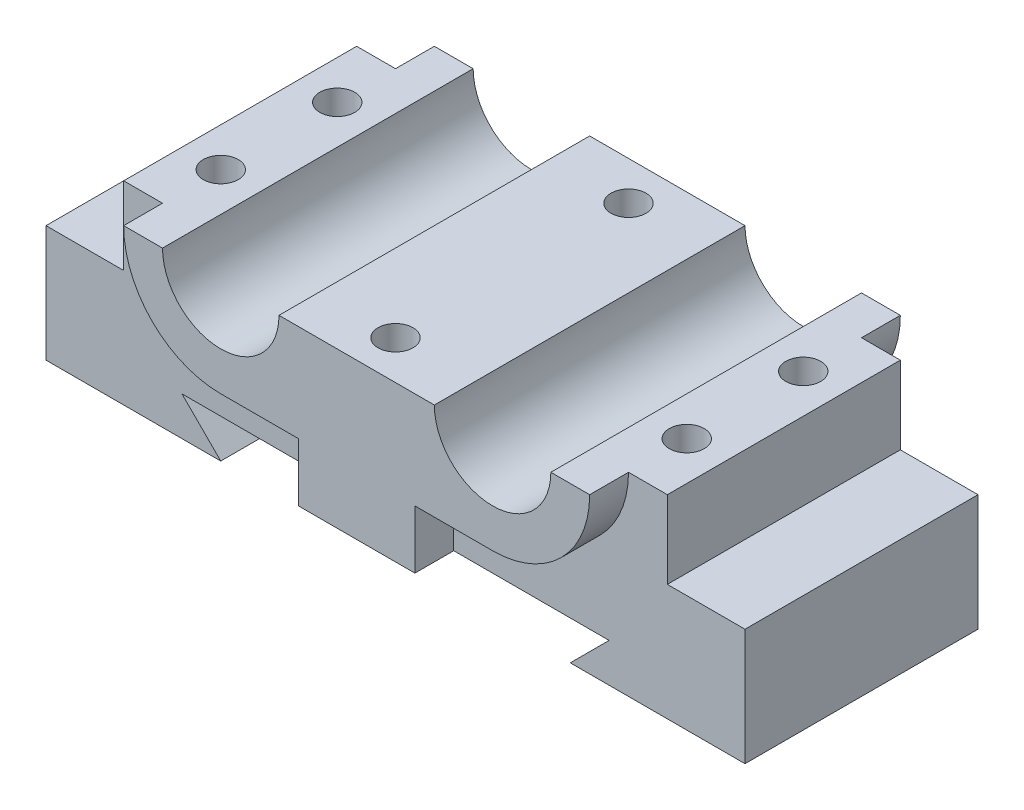
ISO-10303-21;
HEADER;
FILE_DESCRIPTION(('STEP AP214'),'2;1');
FILE_NAME('part.step','',(''),(''),'','','');
FILE_SCHEMA(('AUTOMOTIVE_DESIGN { 1 0 10303 214 1 1 1 1 }'));
ENDSEC;
DATA;
#1=APPLICATION_CONTEXT('core data for automotive mechanical design processes');
#2=APPLICATION_PROTOCOL_DEFINITION('international standard','automotive_design',2000,#1);
#3=PRODUCT_CONTEXT('',#1,'mechanical');
#4=PRODUCT('Part','Part','',(#3));
#5=PRODUCT_RELATED_PRODUCT_CATEGORY('part','',(#4));
#6=PRODUCT_DEFINITION_FORMATION('','',#4);
#7=PRODUCT_DEFINITION_CONTEXT('part definition',#1,'design');
#8=PRODUCT_DEFINITION('design','',#6,#7);
#9=PRODUCT_DEFINITION_SHAPE('','',#8);
#10=(LENGTH_UNIT() NAMED_UNIT(*) SI_UNIT(.MILLI.,.METRE.));
#11=(NAMED_UNIT(*) PLANE_ANGLE_UNIT() SI_UNIT($,.RADIAN.));
#12=(NAMED_UNIT(*) SI_UNIT($,.STERADIAN.) SOLID_ANGLE_UNIT());
#13=UNCERTAINTY_MEASURE_WITH_UNIT(LENGTH_MEASURE(1.E-05),#10,'distance_accuracy_value','');
#14=(GEOMETRIC_REPRESENTATION_CONTEXT(3) GLOBAL_UNCERTAINTY_ASSIGNED_CONTEXT((#13)) GLOBAL_UNIT_ASSIGNED_CONTEXT((#10,
#11,#12)) REPRESENTATION_CONTEXT('',''));
#15=CARTESIAN_POINT('',(0.,0.,0.));
#16=DIRECTION('',(0.,0.,1.));
#17=DIRECTION('',(1.,0.,0.));
#18=AXIS2_PLACEMENT_3D('',#15,#16,#17);
#19=CARTESIAN_POINT('',(9.99999999999999,25.,30.));
#20=DIRECTION('',(0.,-1.,0.));
#21=DIRECTION('',(0.,0.,-1.));
#22=AXIS2_PLACEMENT_3D('',#19,#20,#21);
#23=PLANE('',#22);
#24=CARTESIAN_POINT('',(15.,25.,22.5));
#25=DIRECTION('',(0.,1.,0.));
#26=DIRECTION('',(0.,0.,1.));
#27=AXIS2_PLACEMENT_3D('',#24,#25,#26);
#28=CIRCLE('',#27,2.25);
#29=CARTESIAN_POINT('',(15.,25.,24.75));
#30=VERTEX_POINT('',#29);
#31=EDGE_CURVE('E309',#30,#30,#28,.T.);
#32=ORIENTED_EDGE('',*,*,#31,.F.);
#33=EDGE_LOOP('',(#32));
#34=FACE_BOUND('',#33,.T.);
#35=CARTESIAN_POINT('',(15.,25.,7.5));
#36=DIRECTION('',(0.,1.,0.));
#37=DIRECTION('',(0.,0.,1.));
#38=AXIS2_PLACEMENT_3D('',#35,#36,#37);
#39=CIRCLE('',#38,2.25);
#40=CARTESIAN_POINT('',(15.,25.,9.75));
#41=VERTEX_POINT('',#40);
#42=EDGE_CURVE('E296',#41,#41,#39,.T.);
#43=ORIENTED_EDGE('',*,*,#42,.F.);
#44=EDGE_LOOP('',(#43));
#45=FACE_BOUND('',#44,.T.);
#46=DIRECTION('',(0.,0.,-1.));
#47=VECTOR('',#46,1.);
#48=CARTESIAN_POINT('',(20.,25.,35.));
#49=LINE('',#48,#47);
#50=CARTESIAN_POINT('',(20.,25.,-5.));
#51=VERTEX_POINT('',#50);
#52=CARTESIAN_POINT('',(20.,25.,35.));
#53=VERTEX_POINT('',#52);
#54=EDGE_CURVE('E55',#51,#53,#49,.F.);
#55=ORIENTED_EDGE('',*,*,#54,.F.);
#56=DIRECTION('',(-1.,0.,0.));
#57=VECTOR('',#56,1.);
#58=CARTESIAN_POINT('',(75.,25.,-5.));
#59=LINE('',#58,#57);
#60=CARTESIAN_POINT('',(15.,25.,-5.));
#61=VERTEX_POINT('',#60);
#62=EDGE_CURVE('E367',#51,#61,#59,.T.);
#63=ORIENTED_EDGE('',*,*,#62,.T.);
#64=DIRECTION('',(0.,0.,-1.));
#65=VECTOR('',#64,1.);
#66=CARTESIAN_POINT('',(15.,25.,35.));
#67=LINE('',#66,#65);
#68=CARTESIAN_POINT('',(15.,25.,0.));
#69=VERTEX_POINT('',#68);
#70=EDGE_CURVE('E404',#69,#61,#67,.T.);
#71=ORIENTED_EDGE('',*,*,#70,.F.);
#72=DIRECTION('',(-1.,0.,0.));
#73=VECTOR('',#72,1.);
#74=CARTESIAN_POINT('',(9.99999999999999,25.,0.));
#75=LINE('',#74,#73);
#76=CARTESIAN_POINT('',(9.99999999999999,25.,0.));
#77=VERTEX_POINT('',#76);
#78=EDGE_CURVE('E489',#69,#77,#75,.T.);
#79=ORIENTED_EDGE('',*,*,#78,.T.);
#80=DIRECTION('',(0.,0.,-1.));
#81=VECTOR('',#80,1.);
#82=CARTESIAN_POINT('',(9.99999999999999,25.,30.));
#83=LINE('',#82,#81);
#84=CARTESIAN_POINT('',(9.99999999999999,25.,30.));
#85=VERTEX_POINT('',#84);
#86=EDGE_CURVE('E506',#85,#77,#83,.T.);
#87=ORIENTED_EDGE('',*,*,#86,.F.);
#88=DIRECTION('',(-1.,0.,0.));
#89=VECTOR('',#88,1.);
#90=CARTESIAN_POINT('',(9.99999999999999,25.,30.));
#91=LINE('',#90,#89);
#92=CARTESIAN_POINT('',(15.,25.,30.));
#93=VERTEX_POINT('',#92);
#94=EDGE_CURVE('E461',#93,#85,#91,.T.);
#95=ORIENTED_EDGE('',*,*,#94,.F.);
#96=CARTESIAN_POINT('',(15.,25.,35.));
#97=VERTEX_POINT('',#96);
#98=EDGE_CURVE('E405',#97,#93,#67,.T.);
#99=ORIENTED_EDGE('',*,*,#98,.F.);
#100=DIRECTION('',(-1.,0.,0.));
#101=VECTOR('',#100,1.);
#102=CARTESIAN_POINT('',(75.,25.,35.));
#103=LINE('',#102,#101);
#104=EDGE_CURVE('E272',#53,#97,#103,.T.);
#105=ORIENTED_EDGE('',*,*,#104,.F.);
#106=EDGE_LOOP('',(#55,#63,#71,#79,#87,#95,#99,#105));
#107=FACE_BOUND('',#106,.T.);
#108=ADVANCED_FACE('F41',(#34,#45,#107),#23,.F.);
#109=CARTESIAN_POINT('',(45.,25.,30.));
#110=DIRECTION('',(0.,1.,0.));
#111=DIRECTION('',(0.,0.,1.));
#112=AXIS2_PLACEMENT_3D('',#109,#110,#111);
#113=CIRCLE('',#112,2.25);
#114=CARTESIAN_POINT('',(45.,25.,32.25));
#115=VERTEX_POINT('',#114);
#116=EDGE_CURVE('E321',#115,#115,#113,.T.);
#117=ORIENTED_EDGE('',*,*,#116,.F.);
#118=EDGE_LOOP('',(#117));
#119=FACE_BOUND('',#118,.T.);
#120=CARTESIAN_POINT('',(45.,25.,0.));
#121=DIRECTION('',(0.,1.,0.));
#122=DIRECTION('',(0.,0.,1.));
#123=AXIS2_PLACEMENT_3D('',#120,#121,#122);
#124=CIRCLE('',#123,2.25);
#125=CARTESIAN_POINT('',(45.,25.,2.25));
#126=VERTEX_POINT('',#125);
#127=EDGE_CURVE('E302',#126,#126,#124,.T.);
#128=ORIENTED_EDGE('',*,*,#127,.F.);
#129=EDGE_LOOP('',(#128));
#130=FACE_BOUND('',#129,.T.);
#131=DIRECTION('',(0.,0.,-1.));
#132=VECTOR('',#131,1.);
#133=CARTESIAN_POINT('',(35.,25.,35.));
#134=LINE('',#133,#132);
#135=CARTESIAN_POINT('',(35.,25.,35.));
#136=VERTEX_POINT('',#135);
#137=CARTESIAN_POINT('',(35.,25.,-5.));
#138=VERTEX_POINT('',#137);
#139=EDGE_CURVE('E288',#136,#138,#134,.T.);
#140=ORIENTED_EDGE('',*,*,#139,.F.);
#141=CARTESIAN_POINT('',(55.,25.,35.));
#142=VERTEX_POINT('',#141);
#143=EDGE_CURVE('E270',#142,#136,#103,.T.);
#144=ORIENTED_EDGE('',*,*,#143,.F.);
#145=DIRECTION('',(0.,0.,-1.));
#146=VECTOR('',#145,1.);
#147=CARTESIAN_POINT('',(55.,25.,35.));
#148=LINE('',#147,#146);
#149=CARTESIAN_POINT('',(55.,25.,-5.));
#150=VERTEX_POINT('',#149);
#151=EDGE_CURVE('E63',#150,#142,#148,.F.);
#152=ORIENTED_EDGE('',*,*,#151,.F.);
#153=EDGE_CURVE('E377',#150,#138,#59,.T.);
#154=ORIENTED_EDGE('',*,*,#153,.T.);
#155=EDGE_LOOP('',(#140,#144,#152,#154));
#156=FACE_BOUND('',#155,.T.);
#157=ADVANCED_FACE('F343',(#119,#130,#156),#23,.F.);
#158=CARTESIAN_POINT('',(75.,25.,7.5));
#159=DIRECTION('',(0.,1.,0.));
#160=DIRECTION('',(0.,0.,1.));
#161=AXIS2_PLACEMENT_3D('',#158,#159,#160);
#162=CIRCLE('',#161,2.25);
#163=CARTESIAN_POINT('',(75.,25.,9.74999999999999));
#164=VERTEX_POINT('',#163);
#165=EDGE_CURVE('E314',#164,#164,#162,.T.);
#166=ORIENTED_EDGE('',*,*,#165,.F.);
#167=EDGE_LOOP('',(#166));
#168=FACE_BOUND('',#167,.T.);
#169=CARTESIAN_POINT('',(75.,25.,22.5));
#170=DIRECTION('',(0.,1.,0.));
#171=DIRECTION('',(0.,0.,1.));
#172=AXIS2_PLACEMENT_3D('',#169,#170,#171);
#173=CIRCLE('',#172,2.25);
#174=CARTESIAN_POINT('',(75.,25.,24.75));
#175=VERTEX_POINT('',#174);
#176=EDGE_CURVE('E326',#175,#175,#173,.T.);
#177=ORIENTED_EDGE('',*,*,#176,.F.);
#178=EDGE_LOOP('',(#177));
#179=FACE_BOUND('',#178,.T.);
#180=DIRECTION('',(0.,0.,-1.));
#181=VECTOR('',#180,1.);
#182=CARTESIAN_POINT('',(70.,25.,35.));
#183=LINE('',#182,#181);
#184=CARTESIAN_POINT('',(70.,25.,35.));
#185=VERTEX_POINT('',#184);
#186=CARTESIAN_POINT('',(70.,25.,-5.));
#187=VERTEX_POINT('',#186);
#188=EDGE_CURVE('E248',#185,#187,#183,.T.);
#189=ORIENTED_EDGE('',*,*,#188,.F.);
#190=CARTESIAN_POINT('',(75.,25.,35.));
#191=VERTEX_POINT('',#190);
#192=EDGE_CURVE('E260',#191,#185,#103,.T.);
#193=ORIENTED_EDGE('',*,*,#192,.F.);
#194=DIRECTION('',(0.,0.,-1.));
#195=VECTOR('',#194,1.);
#196=CARTESIAN_POINT('',(75.,25.,35.));
#197=LINE('',#196,#195);
#198=CARTESIAN_POINT('',(75.,25.,30.));
#199=VERTEX_POINT('',#198);
#200=EDGE_CURVE('E409',#191,#199,#197,.T.);
#201=ORIENTED_EDGE('',*,*,#200,.T.);
#202=CARTESIAN_POINT('',(80.,25.,30.));
#203=VERTEX_POINT('',#202);
#204=EDGE_CURVE('E462',#203,#199,#91,.T.);
#205=ORIENTED_EDGE('',*,*,#204,.F.);
#206=DIRECTION('',(0.,0.,-1.));
#207=VECTOR('',#206,1.);
#208=CARTESIAN_POINT('',(80.,25.,30.));
#209=LINE('',#208,#207);
#210=CARTESIAN_POINT('',(80.,25.,0.));
#211=VERTEX_POINT('',#210);
#212=EDGE_CURVE('E509',#203,#211,#209,.T.);
#213=ORIENTED_EDGE('',*,*,#212,.T.);
#214=CARTESIAN_POINT('',(75.,25.,0.));
#215=VERTEX_POINT('',#214);
#216=EDGE_CURVE('E490',#211,#215,#75,.T.);
#217=ORIENTED_EDGE('',*,*,#216,.T.);
#218=CARTESIAN_POINT('',(75.,25.,-5.));
#219=VERTEX_POINT('',#218);
#220=EDGE_CURVE('E408',#215,#219,#197,.T.);
#221=ORIENTED_EDGE('',*,*,#220,.T.);
#222=EDGE_CURVE('E262',#219,#187,#59,.T.);
#223=ORIENTED_EDGE('',*,*,#222,.T.);
#224=EDGE_LOOP('',(#189,#193,#201,#205,#213,#217,#221,#223));
#225=FACE_BOUND('',#224,.T.);
#226=ADVANCED_FACE('F258',(#168,#179,#225),#23,.F.);
#227=CARTESIAN_POINT('',(0.,0.,30.));
#228=DIRECTION('',(0.,0.,-1.));
#229=DIRECTION('',(-1.,0.,0.));
#230=AXIS2_PLACEMENT_3D('',#227,#228,#229);
#231=PLANE('',#230);
#232=DIRECTION('',(0.,1.,0.));
#233=VECTOR('',#232,1.);
#234=CARTESIAN_POINT('',(52.5,0.,30.));
#235=LINE('',#234,#233);
#236=CARTESIAN_POINT('',(52.5,5.00000000000001,30.));
#237=VERTEX_POINT('',#236);
#238=CARTESIAN_POINT('',(52.5,12.5,30.));
#239=VERTEX_POINT('',#238);
#240=EDGE_CURVE('E438',#237,#239,#235,.T.);
#241=ORIENTED_EDGE('',*,*,#240,.F.);
#242=DIRECTION('',(1.,0.,0.));
#243=VECTOR('',#242,1.);
#244=CARTESIAN_POINT('',(72.5,5.00000000000001,30.));
#245=LINE('',#244,#243);
#246=CARTESIAN_POINT('',(72.5,5.00000000000001,30.));
#247=VERTEX_POINT('',#246);
#248=EDGE_CURVE('E448',#237,#247,#245,.T.);
#249=ORIENTED_EDGE('',*,*,#248,.T.);
#250=DIRECTION('',(-0.707106781186547,-0.707106781186548,0.));
#251=VECTOR('',#250,1.);
#252=CARTESIAN_POINT('',(67.5,0.,30.));
#253=LINE('',#252,#251);
#254=CARTESIAN_POINT('',(67.5,0.,30.));
#255=VERTEX_POINT('',#254);
#256=EDGE_CURVE('E451',#247,#255,#253,.T.);
#257=ORIENTED_EDGE('',*,*,#256,.T.);
#258=DIRECTION('',(1.,0.,0.));
#259=VECTOR('',#258,1.);
#260=CARTESIAN_POINT('',(90.,0.,30.));
#261=LINE('',#260,#259);
#262=CARTESIAN_POINT('',(90.,0.,30.));
#263=VERTEX_POINT('',#262);
#264=EDGE_CURVE('E453',#255,#263,#261,.T.);
#265=ORIENTED_EDGE('',*,*,#264,.T.);
#266=DIRECTION('',(0.,1.,0.));
#267=VECTOR('',#266,1.);
#268=CARTESIAN_POINT('',(90.,15.,30.));
#269=LINE('',#268,#267);
#270=CARTESIAN_POINT('',(90.,15.,30.));
#271=VERTEX_POINT('',#270);
#272=EDGE_CURVE('E455',#263,#271,#269,.T.);
#273=ORIENTED_EDGE('',*,*,#272,.T.);
#274=DIRECTION('',(-1.,0.,0.));
#275=VECTOR('',#274,1.);
#276=CARTESIAN_POINT('',(80.,15.,30.));
#277=LINE('',#276,#275);
#278=CARTESIAN_POINT('',(80.,15.,30.));
#279=VERTEX_POINT('',#278);
#280=EDGE_CURVE('E457',#271,#279,#277,.T.);
#281=ORIENTED_EDGE('',*,*,#280,.T.);
#282=DIRECTION('',(0.,1.,0.));
#283=VECTOR('',#282,1.);
#284=CARTESIAN_POINT('',(80.,25.,30.));
#285=LINE('',#284,#283);
#286=EDGE_CURVE('E459',#279,#203,#285,.T.);
#287=ORIENTED_EDGE('',*,*,#286,.T.);
#288=ORIENTED_EDGE('',*,*,#204,.T.);
#289=CARTESIAN_POINT('',(62.5,25.,30.));
#290=DIRECTION('',(0.,0.,-1.));
#291=DIRECTION('',(-1.,0.,0.));
#292=AXIS2_PLACEMENT_3D('',#289,#290,#291);
#293=CIRCLE('',#292,12.5);
#294=CARTESIAN_POINT('',(62.5,12.5,30.));
#295=VERTEX_POINT('',#294);
#296=EDGE_CURVE('E432',#295,#199,#293,.F.);
#297=ORIENTED_EDGE('',*,*,#296,.F.);
#298=DIRECTION('',(1.,0.,0.));
#299=VECTOR('',#298,1.);
#300=CARTESIAN_POINT('',(0.,12.5,30.));
#301=LINE('',#300,#299);
#302=EDGE_CURVE('E435',#239,#295,#301,.T.);
#303=ORIENTED_EDGE('',*,*,#302,.F.);
#304=EDGE_LOOP('',(#241,#249,#257,#265,#273,#281,#287,#288,#297,#303));
#305=FACE_BOUND('',#304,.T.);
#306=ADVANCED_FACE('F342',(#305),#231,.F.);
#307=CARTESIAN_POINT('',(27.5,25.,30.));
#308=DIRECTION('',(0.,0.,-1.));
#309=DIRECTION('',(-1.,0.,0.));
#310=AXIS2_PLACEMENT_3D('',#307,#308,#309);
#311=CIRCLE('',#310,12.5);
#312=CARTESIAN_POINT('',(27.5,12.5,30.));
#313=VERTEX_POINT('',#312);
#314=EDGE_CURVE('E429',#93,#313,#311,.F.);
#315=ORIENTED_EDGE('',*,*,#314,.F.);
#316=ORIENTED_EDGE('',*,*,#94,.T.);
#317=DIRECTION('',(0.,-1.,0.));
#318=VECTOR('',#317,1.);
#319=CARTESIAN_POINT('',(9.99999999999999,15.,30.));
#320=LINE('',#319,#318);
#321=CARTESIAN_POINT('',(9.99999999999999,15.,30.));
#322=VERTEX_POINT('',#321);
#323=EDGE_CURVE('E464',#85,#322,#320,.T.);
#324=ORIENTED_EDGE('',*,*,#323,.T.);
#325=DIRECTION('',(-1.,0.,0.));
#326=VECTOR('',#325,1.);
#327=CARTESIAN_POINT('',(0.,15.,30.));
#328=LINE('',#327,#326);
#329=CARTESIAN_POINT('',(0.,15.,30.));
#330=VERTEX_POINT('',#329);
#331=EDGE_CURVE('E466',#322,#330,#328,.T.);
#332=ORIENTED_EDGE('',*,*,#331,.T.);
#333=DIRECTION('',(0.,-1.,0.));
#334=VECTOR('',#333,1.);
#335=CARTESIAN_POINT('',(0.,0.,30.));
#336=LINE('',#335,#334);
#337=CARTESIAN_POINT('',(0.,0.,30.));
#338=VERTEX_POINT('',#337);
#339=EDGE_CURVE('E468',#330,#338,#336,.T.);
#340=ORIENTED_EDGE('',*,*,#339,.T.);
#341=DIRECTION('',(1.,0.,0.));
#342=VECTOR('',#341,1.);
#343=CARTESIAN_POINT('',(22.5,0.,30.));
#344=LINE('',#343,#342);
#345=CARTESIAN_POINT('',(22.5,0.,30.));
#346=VERTEX_POINT('',#345);
#347=EDGE_CURVE('E442',#338,#346,#344,.T.);
#348=ORIENTED_EDGE('',*,*,#347,.T.);
#349=DIRECTION('',(-0.707106781186548,0.707106781186547,0.));
#350=VECTOR('',#349,1.);
#351=CARTESIAN_POINT('',(17.5,5.,30.));
#352=LINE('',#351,#350);
#353=CARTESIAN_POINT('',(17.5,5.,30.));
#354=VERTEX_POINT('',#353);
#355=EDGE_CURVE('E445',#346,#354,#352,.T.);
#356=ORIENTED_EDGE('',*,*,#355,.T.);
#357=CARTESIAN_POINT('',(37.5,5.,30.));
#358=VERTEX_POINT('',#357);
#359=EDGE_CURVE('E449',#354,#358,#245,.T.);
#360=ORIENTED_EDGE('',*,*,#359,.T.);
#361=DIRECTION('',(0.,-1.,0.));
#362=VECTOR('',#361,1.);
#363=CARTESIAN_POINT('',(37.5,0.,30.));
#364=LINE('',#363,#362);
#365=CARTESIAN_POINT('',(37.5,12.5,30.));
#366=VERTEX_POINT('',#365);
#367=EDGE_CURVE('E423',#366,#358,#364,.T.);
#368=ORIENTED_EDGE('',*,*,#367,.F.);
#369=DIRECTION('',(1.,0.,0.));
#370=VECTOR('',#369,1.);
#371=CARTESIAN_POINT('',(0.,12.5,30.));
#372=LINE('',#371,#370);
#373=EDGE_CURVE('E426',#313,#366,#372,.T.);
#374=ORIENTED_EDGE('',*,*,#373,.F.);
#375=EDGE_LOOP('',(#315,#316,#324,#332,#340,#348,#356,#360,#368,#374));
#376=FACE_BOUND('',#375,.T.);
#377=ADVANCED_FACE('F350',(#376),#231,.F.);
#378=CARTESIAN_POINT('',(0.,0.,0.));
#379=DIRECTION('',(0.,0.,-1.));
#380=DIRECTION('',(-1.,0.,0.));
#381=AXIS2_PLACEMENT_3D('',#378,#379,#380);
#382=PLANE('',#381);
#383=DIRECTION('',(1.,0.,0.));
#384=VECTOR('',#383,1.);
#385=CARTESIAN_POINT('',(72.5,5.00000000000001,0.));
#386=LINE('',#385,#384);
#387=CARTESIAN_POINT('',(52.5,5.,0.));
#388=VERTEX_POINT('',#387);
#389=CARTESIAN_POINT('',(72.5,5.00000000000001,0.));
#390=VERTEX_POINT('',#389);
#391=EDGE_CURVE('E475',#388,#390,#386,.T.);
#392=ORIENTED_EDGE('',*,*,#391,.F.);
#393=DIRECTION('',(0.,1.,0.));
#394=VECTOR('',#393,1.);
#395=CARTESIAN_POINT('',(52.5,0.,0.));
#396=LINE('',#395,#394);
#397=CARTESIAN_POINT('',(52.5,12.5,0.));
#398=VERTEX_POINT('',#397);
#399=EDGE_CURVE('E254',#388,#398,#396,.T.);
#400=ORIENTED_EDGE('',*,*,#399,.T.);
#401=DIRECTION('',(1.,0.,0.));
#402=VECTOR('',#401,1.);
#403=CARTESIAN_POINT('',(0.,12.5,0.));
#404=LINE('',#403,#402);
#405=CARTESIAN_POINT('',(62.5,12.5,0.));
#406=VERTEX_POINT('',#405);
#407=EDGE_CURVE('E545',#398,#406,#404,.T.);
#408=ORIENTED_EDGE('',*,*,#407,.T.);
#409=CARTESIAN_POINT('',(62.5,25.,0.));
#410=DIRECTION('',(0.,0.,-1.));
#411=DIRECTION('',(-1.,0.,0.));
#412=AXIS2_PLACEMENT_3D('',#409,#410,#411);
#413=CIRCLE('',#412,12.5);
#414=EDGE_CURVE('E542',#406,#215,#413,.F.);
#415=ORIENTED_EDGE('',*,*,#414,.T.);
#416=ORIENTED_EDGE('',*,*,#216,.F.);
#417=DIRECTION('',(0.,1.,0.));
#418=VECTOR('',#417,1.);
#419=CARTESIAN_POINT('',(80.,25.,0.));
#420=LINE('',#419,#418);
#421=CARTESIAN_POINT('',(80.,15.,0.));
#422=VERTEX_POINT('',#421);
#423=EDGE_CURVE('E487',#422,#211,#420,.T.);
#424=ORIENTED_EDGE('',*,*,#423,.F.);
#425=DIRECTION('',(-1.,0.,0.));
#426=VECTOR('',#425,1.);
#427=CARTESIAN_POINT('',(80.,15.,0.));
#428=LINE('',#427,#426);
#429=CARTESIAN_POINT('',(90.,15.,0.));
#430=VERTEX_POINT('',#429);
#431=EDGE_CURVE('E485',#430,#422,#428,.T.);
#432=ORIENTED_EDGE('',*,*,#431,.F.);
#433=DIRECTION('',(0.,1.,0.));
#434=VECTOR('',#433,1.);
#435=CARTESIAN_POINT('',(90.,15.,0.));
#436=LINE('',#435,#434);
#437=CARTESIAN_POINT('',(90.,0.,0.));
#438=VERTEX_POINT('',#437);
#439=EDGE_CURVE('E483',#438,#430,#436,.T.);
#440=ORIENTED_EDGE('',*,*,#439,.F.);
#441=DIRECTION('',(1.,0.,0.));
#442=VECTOR('',#441,1.);
#443=CARTESIAN_POINT('',(90.,0.,0.));
#444=LINE('',#443,#442);
#445=CARTESIAN_POINT('',(67.5,0.,0.));
#446=VERTEX_POINT('',#445);
#447=EDGE_CURVE('E481',#446,#438,#444,.T.);
#448=ORIENTED_EDGE('',*,*,#447,.F.);
#449=DIRECTION('',(-0.707106781186547,-0.707106781186548,0.));
#450=VECTOR('',#449,1.);
#451=CARTESIAN_POINT('',(67.5,0.,0.));
#452=LINE('',#451,#450);
#453=EDGE_CURVE('E479',#390,#446,#452,.T.);
#454=ORIENTED_EDGE('',*,*,#453,.F.);
#455=EDGE_LOOP('',(#392,#400,#408,#415,#416,#424,#432,#440,#448,#454));
#456=FACE_BOUND('',#455,.T.);
#457=ADVANCED_FACE('F551',(#456),#382,.T.);
#458=ORIENTED_EDGE('',*,*,#78,.F.);
#459=CARTESIAN_POINT('',(27.5,25.,0.));
#460=DIRECTION('',(0.,0.,-1.));
#461=DIRECTION('',(-1.,0.,0.));
#462=AXIS2_PLACEMENT_3D('',#459,#460,#461);
#463=CIRCLE('',#462,12.5);
#464=CARTESIAN_POINT('',(27.5,12.5,0.));
#465=VERTEX_POINT('',#464);
#466=EDGE_CURVE('E539',#69,#465,#463,.F.);
#467=ORIENTED_EDGE('',*,*,#466,.T.);
#468=DIRECTION('',(1.,0.,0.));
#469=VECTOR('',#468,1.);
#470=CARTESIAN_POINT('',(0.,12.5,0.));
#471=LINE('',#470,#469);
#472=CARTESIAN_POINT('',(37.5,12.5,0.));
#473=VERTEX_POINT('',#472);
#474=EDGE_CURVE('E536',#465,#473,#471,.T.);
#475=ORIENTED_EDGE('',*,*,#474,.T.);
#476=DIRECTION('',(0.,-1.,0.));
#477=VECTOR('',#476,1.);
#478=CARTESIAN_POINT('',(37.5,0.,0.));
#479=LINE('',#478,#477);
#480=CARTESIAN_POINT('',(37.5,5.,0.));
#481=VERTEX_POINT('',#480);
#482=EDGE_CURVE('E533',#473,#481,#479,.T.);
#483=ORIENTED_EDGE('',*,*,#482,.T.);
#484=CARTESIAN_POINT('',(17.5,5.,0.));
#485=VERTEX_POINT('',#484);
#486=EDGE_CURVE('E476',#485,#481,#386,.T.);
#487=ORIENTED_EDGE('',*,*,#486,.F.);
#488=DIRECTION('',(-0.707106781186548,0.707106781186547,0.));
#489=VECTOR('',#488,1.);
#490=CARTESIAN_POINT('',(17.5,5.,0.));
#491=LINE('',#490,#489);
#492=CARTESIAN_POINT('',(22.5,0.,0.));
#493=VERTEX_POINT('',#492);
#494=EDGE_CURVE('E473',#493,#485,#491,.T.);
#495=ORIENTED_EDGE('',*,*,#494,.F.);
#496=DIRECTION('',(1.,0.,0.));
#497=VECTOR('',#496,1.);
#498=CARTESIAN_POINT('',(22.5,0.,0.));
#499=LINE('',#498,#497);
#500=CARTESIAN_POINT('',(0.,0.,0.));
#501=VERTEX_POINT('',#500);
#502=EDGE_CURVE('E441',#501,#493,#499,.T.);
#503=ORIENTED_EDGE('',*,*,#502,.F.);
#504=DIRECTION('',(0.,-1.,0.));
#505=VECTOR('',#504,1.);
#506=CARTESIAN_POINT('',(0.,0.,0.));
#507=LINE('',#506,#505);
#508=CARTESIAN_POINT('',(0.,15.,0.));
#509=VERTEX_POINT('',#508);
#510=EDGE_CURVE('E446',#509,#501,#507,.T.);
#511=ORIENTED_EDGE('',*,*,#510,.F.);
#512=DIRECTION('',(-1.,0.,0.));
#513=VECTOR('',#512,1.);
#514=CARTESIAN_POINT('',(0.,15.,0.));
#515=LINE('',#514,#513);
#516=CARTESIAN_POINT('',(9.99999999999999,15.,0.));
#517=VERTEX_POINT('',#516);
#518=EDGE_CURVE('E495',#517,#509,#515,.T.);
#519=ORIENTED_EDGE('',*,*,#518,.F.);
#520=DIRECTION('',(0.,-1.,0.));
#521=VECTOR('',#520,1.);
#522=CARTESIAN_POINT('',(9.99999999999999,15.,0.));
#523=LINE('',#522,#521);
#524=EDGE_CURVE('E493',#77,#517,#523,.T.);
#525=ORIENTED_EDGE('',*,*,#524,.F.);
#526=EDGE_LOOP('',(#458,#467,#475,#483,#487,#495,#503,#511,#519,#525));
#527=FACE_BOUND('',#526,.T.);
#528=ADVANCED_FACE('F652',(#527),#382,.T.);
#529=CARTESIAN_POINT('',(22.5,0.,30.));
#530=DIRECTION('',(0.,1.,0.));
#531=DIRECTION('',(-1.,0.,0.));
#532=AXIS2_PLACEMENT_3D('',#529,#530,#531);
#533=PLANE('',#532);
#534=ORIENTED_EDGE('',*,*,#502,.T.);
#535=DIRECTION('',(0.,0.,-1.));
#536=VECTOR('',#535,1.);
#537=CARTESIAN_POINT('',(22.5,0.,30.));
#538=LINE('',#537,#536);
#539=EDGE_CURVE('E530',#346,#493,#538,.T.);
#540=ORIENTED_EDGE('',*,*,#539,.F.);
#541=ORIENTED_EDGE('',*,*,#347,.F.);
#542=DIRECTION('',(0.,0.,-1.));
#543=VECTOR('',#542,1.);
#544=CARTESIAN_POINT('',(0.,0.,30.));
#545=LINE('',#544,#543);
#546=EDGE_CURVE('E470',#338,#501,#545,.T.);
#547=ORIENTED_EDGE('',*,*,#546,.T.);
#548=EDGE_LOOP('',(#534,#540,#541,#547));
#549=FACE_BOUND('',#548,.T.);
#550=ADVANCED_FACE('F43',(#549),#533,.F.);
#551=CARTESIAN_POINT('',(17.5,5.,30.));
#552=DIRECTION('',(-0.707106781186547,-0.707106781186548,0.));
#553=DIRECTION('',(0.707106781186548,-0.707106781186547,0.));
#554=AXIS2_PLACEMENT_3D('',#551,#552,#553);
#555=PLANE('',#554);
#556=ORIENTED_EDGE('',*,*,#494,.T.);
#557=DIRECTION('',(0.,0.,-1.));
#558=VECTOR('',#557,1.);
#559=CARTESIAN_POINT('',(17.5,5.,30.));
#560=LINE('',#559,#558);
#561=EDGE_CURVE('E527',#354,#485,#560,.T.);
#562=ORIENTED_EDGE('',*,*,#561,.F.);
#563=ORIENTED_EDGE('',*,*,#355,.F.);
#564=ORIENTED_EDGE('',*,*,#539,.T.);
#565=EDGE_LOOP('',(#556,#562,#563,#564));
#566=FACE_BOUND('',#565,.T.);
#567=ADVANCED_FACE('F688',(#566),#555,.F.);
#568=CARTESIAN_POINT('',(72.5,5.00000000000001,30.));
#569=DIRECTION('',(0.,1.,0.));
#570=DIRECTION('',(-1.,0.,0.));
#571=AXIS2_PLACEMENT_3D('',#568,#569,#570);
#572=PLANE('',#571);
#573=DIRECTION('',(0.,0.,-1.));
#574=VECTOR('',#573,1.);
#575=CARTESIAN_POINT('',(37.5,5.,35.));
#576=LINE('',#575,#574);
#577=CARTESIAN_POINT('',(37.5,5.,35.));
#578=VERTEX_POINT('',#577);
#579=EDGE_CURVE('E392',#578,#358,#576,.T.);
#580=ORIENTED_EDGE('',*,*,#579,.T.);
#581=ORIENTED_EDGE('',*,*,#359,.F.);
#582=ORIENTED_EDGE('',*,*,#561,.T.);
#583=ORIENTED_EDGE('',*,*,#486,.T.);
#584=CARTESIAN_POINT('',(37.5,5.,-5.));
#585=VERTEX_POINT('',#584);
#586=EDGE_CURVE('E396',#481,#585,#576,.T.);
#587=ORIENTED_EDGE('',*,*,#586,.T.);
#588=DIRECTION('',(1.,0.,0.));
#589=VECTOR('',#588,1.);
#590=CARTESIAN_POINT('',(45.,5.,-5.));
#591=LINE('',#590,#589);
#592=CARTESIAN_POINT('',(52.5,5.,-5.));
#593=VERTEX_POINT('',#592);
#594=EDGE_CURVE('E287',#585,#593,#591,.T.);
#595=ORIENTED_EDGE('',*,*,#594,.T.);
#596=DIRECTION('',(0.,0.,-1.));
#597=VECTOR('',#596,1.);
#598=CARTESIAN_POINT('',(52.5,5.,35.));
#599=LINE('',#598,#597);
#600=EDGE_CURVE('E419',#388,#593,#599,.T.);
#601=ORIENTED_EDGE('',*,*,#600,.F.);
#602=ORIENTED_EDGE('',*,*,#391,.T.);
#603=DIRECTION('',(0.,0.,-1.));
#604=VECTOR('',#603,1.);
#605=CARTESIAN_POINT('',(72.5,5.00000000000001,30.));
#606=LINE('',#605,#604);
#607=EDGE_CURVE('E524',#247,#390,#606,.T.);
#608=ORIENTED_EDGE('',*,*,#607,.F.);
#609=ORIENTED_EDGE('',*,*,#248,.F.);
#610=CARTESIAN_POINT('',(52.5,5.,35.));
#611=VERTEX_POINT('',#610);
#612=EDGE_CURVE('E420',#611,#237,#599,.T.);
#613=ORIENTED_EDGE('',*,*,#612,.F.);
#614=DIRECTION('',(1.,0.,0.));
#615=VECTOR('',#614,1.);
#616=CARTESIAN_POINT('',(45.,5.,35.));
#617=LINE('',#616,#615);
#618=EDGE_CURVE('E283',#578,#611,#617,.T.);
#619=ORIENTED_EDGE('',*,*,#618,.F.);
#620=EDGE_LOOP('',(#580,#581,#582,#583,#587,#595,#601,#602,#608,#609,#613,#619));
#621=FACE_BOUND('',#620,.T.);
#622=ADVANCED_FACE('F560',(#621),#572,.F.);
#623=CARTESIAN_POINT('',(67.5,0.,30.));
#624=DIRECTION('',(0.707106781186548,-0.707106781186547,0.));
#625=DIRECTION('',(0.707106781186547,0.707106781186548,0.));
#626=AXIS2_PLACEMENT_3D('',#623,#624,#625);
#627=PLANE('',#626);
#628=ORIENTED_EDGE('',*,*,#453,.T.);
#629=DIRECTION('',(0.,0.,-1.));
#630=VECTOR('',#629,1.);
#631=CARTESIAN_POINT('',(67.5,0.,30.));
#632=LINE('',#631,#630);
#633=EDGE_CURVE('E521',#255,#446,#632,.T.);
#634=ORIENTED_EDGE('',*,*,#633,.F.);
#635=ORIENTED_EDGE('',*,*,#256,.F.);
#636=ORIENTED_EDGE('',*,*,#607,.T.);
#637=EDGE_LOOP('',(#628,#634,#635,#636));
#638=FACE_BOUND('',#637,.T.);
#639=ADVANCED_FACE('F694',(#638),#627,.F.);
#640=CARTESIAN_POINT('',(90.,0.,30.));
#641=DIRECTION('',(0.,1.,0.));
#642=DIRECTION('',(-1.,0.,0.));
#643=AXIS2_PLACEMENT_3D('',#640,#641,#642);
#644=PLANE('',#643);
#645=ORIENTED_EDGE('',*,*,#447,.T.);
#646=DIRECTION('',(0.,0.,-1.));
#647=VECTOR('',#646,1.);
#648=CARTESIAN_POINT('',(90.,0.,30.));
#649=LINE('',#648,#647);
#650=EDGE_CURVE('E518',#263,#438,#649,.T.);
#651=ORIENTED_EDGE('',*,*,#650,.F.);
#652=ORIENTED_EDGE('',*,*,#264,.F.);
#653=ORIENTED_EDGE('',*,*,#633,.T.);
#654=EDGE_LOOP('',(#645,#651,#652,#653));
#655=FACE_BOUND('',#654,.T.);
#656=ADVANCED_FACE('F699',(#655),#644,.F.);
#657=CARTESIAN_POINT('',(90.,15.,30.));
#658=DIRECTION('',(-1.,0.,0.));
#659=DIRECTION('',(0.,0.,1.));
#660=AXIS2_PLACEMENT_3D('',#657,#658,#659);
#661=PLANE('',#660);
#662=ORIENTED_EDGE('',*,*,#439,.T.);
#663=DIRECTION('',(0.,0.,-1.));
#664=VECTOR('',#663,1.);
#665=CARTESIAN_POINT('',(90.,15.,30.));
#666=LINE('',#665,#664);
#667=EDGE_CURVE('E515',#271,#430,#666,.T.);
#668=ORIENTED_EDGE('',*,*,#667,.F.);
#669=ORIENTED_EDGE('',*,*,#272,.F.);
#670=ORIENTED_EDGE('',*,*,#650,.T.);
#671=EDGE_LOOP('',(#662,#668,#669,#670));
#672=FACE_BOUND('',#671,.T.);
#673=ADVANCED_FACE('F703',(#672),#661,.F.);
#674=CARTESIAN_POINT('',(80.,15.,30.));
#675=DIRECTION('',(0.,-1.,0.));
#676=DIRECTION('',(0.,0.,-1.));
#677=AXIS2_PLACEMENT_3D('',#674,#675,#676);
#678=PLANE('',#677);
#679=ORIENTED_EDGE('',*,*,#431,.T.);
#680=DIRECTION('',(0.,0.,-1.));
#681=VECTOR('',#680,1.);
#682=CARTESIAN_POINT('',(80.,15.,30.));
#683=LINE('',#682,#681);
#684=EDGE_CURVE('E512',#279,#422,#683,.T.);
#685=ORIENTED_EDGE('',*,*,#684,.F.);
#686=ORIENTED_EDGE('',*,*,#280,.F.);
#687=ORIENTED_EDGE('',*,*,#667,.T.);
#688=EDGE_LOOP('',(#679,#685,#686,#687));
#689=FACE_BOUND('',#688,.T.);
#690=ADVANCED_FACE('F665',(#689),#678,.F.);
#691=CARTESIAN_POINT('',(80.,25.,30.));
#692=DIRECTION('',(-1.,0.,0.));
#693=DIRECTION('',(0.,0.,1.));
#694=AXIS2_PLACEMENT_3D('',#691,#692,#693);
#695=PLANE('',#694);
#696=ORIENTED_EDGE('',*,*,#423,.T.);
#697=ORIENTED_EDGE('',*,*,#212,.F.);
#698=ORIENTED_EDGE('',*,*,#286,.F.);
#699=ORIENTED_EDGE('',*,*,#684,.T.);
#700=EDGE_LOOP('',(#696,#697,#698,#699));
#701=FACE_BOUND('',#700,.T.);
#702=ADVANCED_FACE('F606',(#701),#695,.F.);
#703=CARTESIAN_POINT('',(9.99999999999999,15.,30.));
#704=DIRECTION('',(1.,0.,0.));
#705=DIRECTION('',(0.,0.,-1.));
#706=AXIS2_PLACEMENT_3D('',#703,#704,#705);
#707=PLANE('',#706);
#708=ORIENTED_EDGE('',*,*,#524,.T.);
#709=DIRECTION('',(0.,0.,-1.));
#710=VECTOR('',#709,1.);
#711=CARTESIAN_POINT('',(9.99999999999999,15.,30.));
#712=LINE('',#711,#710);
#713=EDGE_CURVE('E503',#322,#517,#712,.T.);
#714=ORIENTED_EDGE('',*,*,#713,.F.);
#715=ORIENTED_EDGE('',*,*,#323,.F.);
#716=ORIENTED_EDGE('',*,*,#86,.T.);
#717=EDGE_LOOP('',(#708,#714,#715,#716));
#718=FACE_BOUND('',#717,.T.);
#719=ADVANCED_FACE('F658',(#718),#707,.F.);
#720=CARTESIAN_POINT('',(0.,15.,30.));
#721=DIRECTION('',(0.,-1.,0.));
#722=DIRECTION('',(0.,0.,-1.));
#723=AXIS2_PLACEMENT_3D('',#720,#721,#722);
#724=PLANE('',#723);
#725=ORIENTED_EDGE('',*,*,#518,.T.);
#726=DIRECTION('',(0.,0.,-1.));
#727=VECTOR('',#726,1.);
#728=CARTESIAN_POINT('',(0.,15.,30.));
#729=LINE('',#728,#727);
#730=EDGE_CURVE('E500',#330,#509,#729,.T.);
#731=ORIENTED_EDGE('',*,*,#730,.F.);
#732=ORIENTED_EDGE('',*,*,#331,.F.);
#733=ORIENTED_EDGE('',*,*,#713,.T.);
#734=EDGE_LOOP('',(#725,#731,#732,#733));
#735=FACE_BOUND('',#734,.T.);
#736=ADVANCED_FACE('F655',(#735),#724,.F.);
#737=CARTESIAN_POINT('',(0.,0.,30.));
#738=DIRECTION('',(1.,0.,0.));
#739=DIRECTION('',(0.,0.,-1.));
#740=AXIS2_PLACEMENT_3D('',#737,#738,#739);
#741=PLANE('',#740);
#742=ORIENTED_EDGE('',*,*,#510,.T.);
#743=ORIENTED_EDGE('',*,*,#546,.F.);
#744=ORIENTED_EDGE('',*,*,#339,.F.);
#745=ORIENTED_EDGE('',*,*,#730,.T.);
#746=EDGE_LOOP('',(#742,#743,#744,#745));
#747=FACE_BOUND('',#746,.T.);
#748=ADVANCED_FACE('F630',(#747),#741,.F.);
#749=CARTESIAN_POINT('',(27.5,25.,-5.));
#750=DIRECTION('',(0.,0.,-1.));
#751=DIRECTION('',(-1.,0.,0.));
#752=AXIS2_PLACEMENT_3D('',#749,#750,#751);
#753=PLANE('',#752);
#754=ORIENTED_EDGE('',*,*,#62,.F.);
#755=CARTESIAN_POINT('',(27.5,25.,-5.));
#756=DIRECTION('',(0.,0.,1.));
#757=DIRECTION('',(1.,0.,0.));
#758=AXIS2_PLACEMENT_3D('',#755,#756,#757);
#759=CIRCLE('',#758,7.5);
#760=EDGE_CURVE('E263',#51,#138,#759,.T.);
#761=ORIENTED_EDGE('',*,*,#760,.T.);
#762=ORIENTED_EDGE('',*,*,#153,.F.);
#763=CARTESIAN_POINT('',(62.5,25.,-5.));
#764=DIRECTION('',(0.,0.,1.));
#765=DIRECTION('',(1.,0.,0.));
#766=AXIS2_PLACEMENT_3D('',#763,#764,#765);
#767=CIRCLE('',#766,7.50000000000001);
#768=EDGE_CURVE('E291',#150,#187,#767,.T.);
#769=ORIENTED_EDGE('',*,*,#768,.T.);
#770=ORIENTED_EDGE('',*,*,#222,.F.);
#771=CARTESIAN_POINT('',(62.5,25.,-5.));
#772=DIRECTION('',(0.,0.,1.));
#773=DIRECTION('',(1.,0.,0.));
#774=AXIS2_PLACEMENT_3D('',#771,#772,#773);
#775=CIRCLE('',#774,12.5);
#776=CARTESIAN_POINT('',(62.5,12.5,-5.));
#777=VERTEX_POINT('',#776);
#778=EDGE_CURVE('E378',#777,#219,#775,.T.);
#779=ORIENTED_EDGE('',*,*,#778,.F.);
#780=DIRECTION('',(1.,0.,0.));
#781=VECTOR('',#780,1.);
#782=CARTESIAN_POINT('',(52.5,12.5,-5.));
#783=LINE('',#782,#781);
#784=CARTESIAN_POINT('',(52.5,12.5,-5.));
#785=VERTEX_POINT('',#784);
#786=EDGE_CURVE('E381',#785,#777,#783,.T.);
#787=ORIENTED_EDGE('',*,*,#786,.F.);
#788=DIRECTION('',(0.,1.,0.));
#789=VECTOR('',#788,1.);
#790=CARTESIAN_POINT('',(52.5,5.,-5.));
#791=LINE('',#790,#789);
#792=EDGE_CURVE('E565',#593,#785,#791,.T.);
#793=ORIENTED_EDGE('',*,*,#792,.F.);
#794=ORIENTED_EDGE('',*,*,#594,.F.);
#795=DIRECTION('',(0.,-1.,0.));
#796=VECTOR('',#795,1.);
#797=CARTESIAN_POINT('',(37.5,5.,-5.));
#798=LINE('',#797,#796);
#799=CARTESIAN_POINT('',(37.5,12.5,-5.));
#800=VERTEX_POINT('',#799);
#801=EDGE_CURVE('E285',#800,#585,#798,.T.);
#802=ORIENTED_EDGE('',*,*,#801,.F.);
#803=DIRECTION('',(1.,0.,0.));
#804=VECTOR('',#803,1.);
#805=CARTESIAN_POINT('',(37.5,12.5,-5.));
#806=LINE('',#805,#804);
#807=CARTESIAN_POINT('',(27.5,12.5,-5.));
#808=VERTEX_POINT('',#807);
#809=EDGE_CURVE('E384',#808,#800,#806,.T.);
#810=ORIENTED_EDGE('',*,*,#809,.F.);
#811=CARTESIAN_POINT('',(27.5,25.,-5.));
#812=DIRECTION('',(0.,0.,1.));
#813=DIRECTION('',(-1.,0.,0.));
#814=AXIS2_PLACEMENT_3D('',#811,#812,#813);
#815=CIRCLE('',#814,12.5);
#816=EDGE_CURVE('E376',#61,#808,#815,.T.);
#817=ORIENTED_EDGE('',*,*,#816,.F.);
#818=EDGE_LOOP('',(#754,#761,#762,#769,#770,#779,#787,#793,#794,#802,#810,#817));
#819=FACE_BOUND('',#818,.T.);
#820=ADVANCED_FACE('F371',(#819),#753,.T.);
#821=CARTESIAN_POINT('',(37.5,5.,35.));
#822=DIRECTION('',(1.,0.,0.));
#823=DIRECTION('',(0.,0.,-1.));
#824=AXIS2_PLACEMENT_3D('',#821,#822,#823);
#825=PLANE('',#824);
#826=ORIENTED_EDGE('',*,*,#482,.F.);
#827=DIRECTION('',(0.,0.,-1.));
#828=VECTOR('',#827,1.);
#829=CARTESIAN_POINT('',(37.5,12.5,35.));
#830=LINE('',#829,#828);
#831=EDGE_CURVE('E395',#473,#800,#830,.T.);
#832=ORIENTED_EDGE('',*,*,#831,.T.);
#833=ORIENTED_EDGE('',*,*,#801,.T.);
#834=ORIENTED_EDGE('',*,*,#586,.F.);
#835=EDGE_LOOP('',(#826,#832,#833,#834));
#836=FACE_BOUND('',#835,.T.);
#837=ADVANCED_FACE('F629',(#836),#825,.F.);
#838=CARTESIAN_POINT('',(37.5,12.5,35.));
#839=DIRECTION('',(0.,1.,0.));
#840=DIRECTION('',(-1.,0.,0.));
#841=AXIS2_PLACEMENT_3D('',#838,#839,#840);
#842=PLANE('',#841);
#843=ORIENTED_EDGE('',*,*,#474,.F.);
#844=DIRECTION('',(0.,0.,-1.));
#845=VECTOR('',#844,1.);
#846=CARTESIAN_POINT('',(27.5,12.5,35.));
#847=LINE('',#846,#845);
#848=EDGE_CURVE('E400',#465,#808,#847,.T.);
#849=ORIENTED_EDGE('',*,*,#848,.T.);
#850=ORIENTED_EDGE('',*,*,#809,.T.);
#851=ORIENTED_EDGE('',*,*,#831,.F.);
#852=EDGE_LOOP('',(#843,#849,#850,#851));
#853=FACE_BOUND('',#852,.T.);
#854=ADVANCED_FACE('F633',(#853),#842,.F.);
#855=CARTESIAN_POINT('',(27.5,25.,35.));
#856=DIRECTION('',(0.,0.,-1.));
#857=DIRECTION('',(-1.,0.,0.));
#858=AXIS2_PLACEMENT_3D('',#855,#856,#857);
#859=CYLINDRICAL_SURFACE('',#858,12.5);
#860=ORIENTED_EDGE('',*,*,#466,.F.);
#861=ORIENTED_EDGE('',*,*,#70,.T.);
#862=ORIENTED_EDGE('',*,*,#816,.T.);
#863=ORIENTED_EDGE('',*,*,#848,.F.);
#864=EDGE_LOOP('',(#860,#861,#862,#863));
#865=FACE_BOUND('',#864,.T.);
#866=ADVANCED_FACE('F637',(#865),#859,.T.);
#867=CARTESIAN_POINT('',(62.5,25.,35.));
#868=DIRECTION('',(0.,0.,-1.));
#869=DIRECTION('',(-1.,0.,0.));
#870=AXIS2_PLACEMENT_3D('',#867,#868,#869);
#871=CYLINDRICAL_SURFACE('',#870,12.5);
#872=ORIENTED_EDGE('',*,*,#414,.F.);
#873=DIRECTION('',(0.,0.,-1.));
#874=VECTOR('',#873,1.);
#875=CARTESIAN_POINT('',(62.5,12.5,35.));
#876=LINE('',#875,#874);
#877=EDGE_CURVE('E411',#406,#777,#876,.T.);
#878=ORIENTED_EDGE('',*,*,#877,.T.);
#879=ORIENTED_EDGE('',*,*,#778,.T.);
#880=ORIENTED_EDGE('',*,*,#220,.F.);
#881=EDGE_LOOP('',(#872,#878,#879,#880));
#882=FACE_BOUND('',#881,.T.);
#883=ADVANCED_FACE('F611',(#882),#871,.T.);
#884=CARTESIAN_POINT('',(52.5,12.5,35.));
#885=DIRECTION('',(0.,1.,0.));
#886=DIRECTION('',(-1.,0.,0.));
#887=AXIS2_PLACEMENT_3D('',#884,#885,#886);
#888=PLANE('',#887);
#889=ORIENTED_EDGE('',*,*,#407,.F.);
#890=DIRECTION('',(0.,0.,-1.));
#891=VECTOR('',#890,1.);
#892=CARTESIAN_POINT('',(52.5,12.5,35.));
#893=LINE('',#892,#891);
#894=EDGE_CURVE('E415',#398,#785,#893,.T.);
#895=ORIENTED_EDGE('',*,*,#894,.T.);
#896=ORIENTED_EDGE('',*,*,#786,.T.);
#897=ORIENTED_EDGE('',*,*,#877,.F.);
#898=EDGE_LOOP('',(#889,#895,#896,#897));
#899=FACE_BOUND('',#898,.T.);
#900=ADVANCED_FACE('F644',(#899),#888,.F.);
#901=CARTESIAN_POINT('',(52.5,5.,35.));
#902=DIRECTION('',(-1.,0.,0.));
#903=DIRECTION('',(0.,0.,1.));
#904=AXIS2_PLACEMENT_3D('',#901,#902,#903);
#905=PLANE('',#904);
#906=ORIENTED_EDGE('',*,*,#399,.F.);
#907=ORIENTED_EDGE('',*,*,#600,.T.);
#908=ORIENTED_EDGE('',*,*,#792,.T.);
#909=ORIENTED_EDGE('',*,*,#894,.F.);
#910=EDGE_LOOP('',(#906,#907,#908,#909));
#911=FACE_BOUND('',#910,.T.);
#912=ADVANCED_FACE('F556',(#911),#905,.F.);
#913=ORIENTED_EDGE('',*,*,#612,.T.);
#914=ORIENTED_EDGE('',*,*,#240,.T.);
#915=CARTESIAN_POINT('',(52.5,12.5,35.));
#916=VERTEX_POINT('',#915);
#917=EDGE_CURVE('E416',#916,#239,#893,.T.);
#918=ORIENTED_EDGE('',*,*,#917,.F.);
#919=DIRECTION('',(0.,1.,0.));
#920=VECTOR('',#919,1.);
#921=CARTESIAN_POINT('',(52.5,5.,35.));
#922=LINE('',#921,#920);
#923=EDGE_CURVE('E279',#611,#916,#922,.T.);
#924=ORIENTED_EDGE('',*,*,#923,.F.);
#925=EDGE_LOOP('',(#913,#914,#918,#924));
#926=FACE_BOUND('',#925,.T.);
#927=ADVANCED_FACE('F594',(#926),#905,.F.);
#928=ORIENTED_EDGE('',*,*,#917,.T.);
#929=ORIENTED_EDGE('',*,*,#302,.T.);
#930=CARTESIAN_POINT('',(62.5,12.5,35.));
#931=VERTEX_POINT('',#930);
#932=EDGE_CURVE('E412',#931,#295,#876,.T.);
#933=ORIENTED_EDGE('',*,*,#932,.F.);
#934=DIRECTION('',(1.,0.,0.));
#935=VECTOR('',#934,1.);
#936=CARTESIAN_POINT('',(52.5,12.5,35.));
#937=LINE('',#936,#935);
#938=EDGE_CURVE('E278',#916,#931,#937,.T.);
#939=ORIENTED_EDGE('',*,*,#938,.F.);
#940=EDGE_LOOP('',(#928,#929,#933,#939));
#941=FACE_BOUND('',#940,.T.);
#942=ADVANCED_FACE('F596',(#941),#888,.F.);
#943=ORIENTED_EDGE('',*,*,#932,.T.);
#944=ORIENTED_EDGE('',*,*,#296,.T.);
#945=ORIENTED_EDGE('',*,*,#200,.F.);
#946=CARTESIAN_POINT('',(62.5,25.,35.));
#947=DIRECTION('',(0.,0.,1.));
#948=DIRECTION('',(1.,0.,0.));
#949=AXIS2_PLACEMENT_3D('',#946,#947,#948);
#950=CIRCLE('',#949,12.5);
#951=EDGE_CURVE('E267',#931,#191,#950,.T.);
#952=ORIENTED_EDGE('',*,*,#951,.F.);
#953=EDGE_LOOP('',(#943,#944,#945,#952));
#954=FACE_BOUND('',#953,.T.);
#955=ADVANCED_FACE('F598',(#954),#871,.T.);
#956=ORIENTED_EDGE('',*,*,#98,.T.);
#957=ORIENTED_EDGE('',*,*,#314,.T.);
#958=CARTESIAN_POINT('',(27.5,12.5,35.));
#959=VERTEX_POINT('',#958);
#960=EDGE_CURVE('E401',#959,#313,#847,.T.);
#961=ORIENTED_EDGE('',*,*,#960,.F.);
#962=CARTESIAN_POINT('',(27.5,25.,35.));
#963=DIRECTION('',(0.,0.,1.));
#964=DIRECTION('',(-1.,0.,0.));
#965=AXIS2_PLACEMENT_3D('',#962,#963,#964);
#966=CIRCLE('',#965,12.5);
#967=EDGE_CURVE('E269',#97,#959,#966,.T.);
#968=ORIENTED_EDGE('',*,*,#967,.F.);
#969=EDGE_LOOP('',(#956,#957,#961,#968));
#970=FACE_BOUND('',#969,.T.);
#971=ADVANCED_FACE('F641',(#970),#859,.T.);
#972=ORIENTED_EDGE('',*,*,#960,.T.);
#973=ORIENTED_EDGE('',*,*,#373,.T.);
#974=CARTESIAN_POINT('',(37.5,12.5,35.));
#975=VERTEX_POINT('',#974);
#976=EDGE_CURVE('E397',#975,#366,#830,.T.);
#977=ORIENTED_EDGE('',*,*,#976,.F.);
#978=DIRECTION('',(1.,0.,0.));
#979=VECTOR('',#978,1.);
#980=CARTESIAN_POINT('',(37.5,12.5,35.));
#981=LINE('',#980,#979);
#982=EDGE_CURVE('E273',#959,#975,#981,.T.);
#983=ORIENTED_EDGE('',*,*,#982,.F.);
#984=EDGE_LOOP('',(#972,#973,#977,#983));
#985=FACE_BOUND('',#984,.T.);
#986=ADVANCED_FACE('F582',(#985),#842,.F.);
#987=ORIENTED_EDGE('',*,*,#976,.T.);
#988=ORIENTED_EDGE('',*,*,#367,.T.);
#989=ORIENTED_EDGE('',*,*,#579,.F.);
#990=DIRECTION('',(0.,-1.,0.));
#991=VECTOR('',#990,1.);
#992=CARTESIAN_POINT('',(37.5,5.,35.));
#993=LINE('',#992,#991);
#994=EDGE_CURVE('E573',#975,#578,#993,.T.);
#995=ORIENTED_EDGE('',*,*,#994,.F.);
#996=EDGE_LOOP('',(#987,#988,#989,#995));
#997=FACE_BOUND('',#996,.T.);
#998=ADVANCED_FACE('F584',(#997),#825,.F.);
#999=CARTESIAN_POINT('',(27.5,25.,35.));
#1000=DIRECTION('',(0.,0.,-1.));
#1001=DIRECTION('',(-1.,0.,0.));
#1002=AXIS2_PLACEMENT_3D('',#999,#1000,#1001);
#1003=PLANE('',#1002);
#1004=CARTESIAN_POINT('',(27.5,25.,35.));
#1005=DIRECTION('',(0.,0.,-1.));
#1006=DIRECTION('',(-1.,0.,0.));
#1007=AXIS2_PLACEMENT_3D('',#1004,#1005,#1006);
#1008=CIRCLE('',#1007,7.5);
#1009=EDGE_CURVE('E11',#53,#136,#1008,.F.);
#1010=ORIENTED_EDGE('',*,*,#1009,.F.);
#1011=ORIENTED_EDGE('',*,*,#104,.T.);
#1012=ORIENTED_EDGE('',*,*,#967,.T.);
#1013=ORIENTED_EDGE('',*,*,#982,.T.);
#1014=ORIENTED_EDGE('',*,*,#994,.T.);
#1015=ORIENTED_EDGE('',*,*,#618,.T.);
#1016=ORIENTED_EDGE('',*,*,#923,.T.);
#1017=ORIENTED_EDGE('',*,*,#938,.T.);
#1018=ORIENTED_EDGE('',*,*,#951,.T.);
#1019=ORIENTED_EDGE('',*,*,#192,.T.);
#1020=CARTESIAN_POINT('',(62.5,25.,35.));
#1021=DIRECTION('',(0.,0.,-1.));
#1022=DIRECTION('',(-1.,0.,0.));
#1023=AXIS2_PLACEMENT_3D('',#1020,#1021,#1022);
#1024=CIRCLE('',#1023,7.50000000000001);
#1025=EDGE_CURVE('E49',#142,#185,#1024,.F.);
#1026=ORIENTED_EDGE('',*,*,#1025,.F.);
#1027=ORIENTED_EDGE('',*,*,#143,.T.);
#1028=EDGE_LOOP('',(#1010,#1011,#1012,#1013,#1014,#1015,#1016,#1017,#1018,#1019,#1026,#1027));
#1029=FACE_BOUND('',#1028,.T.);
#1030=ADVANCED_FACE('F265',(#1029),#1003,.F.);
#1031=CARTESIAN_POINT('',(62.5,25.,35.));
#1032=DIRECTION('',(0.,0.,-1.));
#1033=DIRECTION('',(-1.,0.,0.));
#1034=AXIS2_PLACEMENT_3D('',#1031,#1032,#1033);
#1035=CYLINDRICAL_SURFACE('',#1034,7.50000000000001);
#1036=ORIENTED_EDGE('',*,*,#151,.T.);
#1037=ORIENTED_EDGE('',*,*,#1025,.T.);
#1038=ORIENTED_EDGE('',*,*,#188,.T.);
#1039=ORIENTED_EDGE('',*,*,#768,.F.);
#1040=EDGE_LOOP('',(#1036,#1037,#1038,#1039));
#1041=FACE_BOUND('',#1040,.T.);
#1042=ADVANCED_FACE('F247',(#1041),#1035,.F.);
#1043=CARTESIAN_POINT('',(27.5,25.,35.));
#1044=DIRECTION('',(0.,0.,-1.));
#1045=DIRECTION('',(-1.,0.,0.));
#1046=AXIS2_PLACEMENT_3D('',#1043,#1044,#1045);
#1047=CYLINDRICAL_SURFACE('',#1046,7.5);
#1048=ORIENTED_EDGE('',*,*,#54,.T.);
#1049=ORIENTED_EDGE('',*,*,#1009,.T.);
#1050=ORIENTED_EDGE('',*,*,#139,.T.);
#1051=ORIENTED_EDGE('',*,*,#760,.F.);
#1052=EDGE_LOOP('',(#1048,#1049,#1050,#1051));
#1053=FACE_BOUND('',#1052,.T.);
#1054=ADVANCED_FACE('F337',(#1053),#1047,.F.);
#1055=CARTESIAN_POINT('',(75.,10.,22.5));
#1056=DIRECTION('',(0.,1.,0.));
#1057=DIRECTION('',(0.,0.,1.));
#1058=AXIS2_PLACEMENT_3D('',#1055,#1056,#1057);
#1059=CYLINDRICAL_SURFACE('',#1058,2.25);
#1060=CARTESIAN_POINT('',(75.,10.,22.5));
#1061=DIRECTION('',(0.,1.,0.));
#1062=DIRECTION('',(0.,0.,1.));
#1063=AXIS2_PLACEMENT_3D('',#1060,#1061,#1062);
#1064=CIRCLE('',#1063,2.25);
#1065=CARTESIAN_POINT('',(75.,10.,24.75));
#1066=VERTEX_POINT('',#1065);
#1067=EDGE_CURVE('E318',#1066,#1066,#1064,.T.);
#1068=ORIENTED_EDGE('',*,*,#1067,.F.);
#1069=EDGE_LOOP('',(#1068));
#1070=FACE_BOUND('',#1069,.T.);
#1071=ORIENTED_EDGE('',*,*,#176,.T.);
#1072=EDGE_LOOP('',(#1071));
#1073=FACE_BOUND('',#1072,.T.);
#1074=ADVANCED_FACE('F334',(#1070,#1073),#1059,.F.);
#1075=CARTESIAN_POINT('',(75.,10.,22.5));
#1076=DIRECTION('',(0.,1.,0.));
#1077=DIRECTION('',(0.,0.,1.));
#1078=AXIS2_PLACEMENT_3D('',#1075,#1076,#1077);
#1079=PLANE('',#1078);
#1080=ORIENTED_EDGE('',*,*,#1067,.T.);
#1081=EDGE_LOOP('',(#1080));
#1082=FACE_BOUND('',#1081,.T.);
#1083=ADVANCED_FACE('F332',(#1082),#1079,.T.);
#1084=CARTESIAN_POINT('',(75.,10.,7.5));
#1085=DIRECTION('',(0.,1.,0.));
#1086=DIRECTION('',(0.,0.,1.));
#1087=AXIS2_PLACEMENT_3D('',#1084,#1085,#1086);
#1088=CYLINDRICAL_SURFACE('',#1087,2.25);
#1089=CARTESIAN_POINT('',(75.,10.,7.5));
#1090=DIRECTION('',(0.,1.,0.));
#1091=DIRECTION('',(0.,0.,1.));
#1092=AXIS2_PLACEMENT_3D('',#1089,#1090,#1091);
#1093=CIRCLE('',#1092,2.25);
#1094=CARTESIAN_POINT('',(75.,10.,9.74999999999999));
#1095=VERTEX_POINT('',#1094);
#1096=EDGE_CURVE('E317',#1095,#1095,#1093,.T.);
#1097=ORIENTED_EDGE('',*,*,#1096,.F.);
#1098=EDGE_LOOP('',(#1097));
#1099=FACE_BOUND('',#1098,.T.);
#1100=ORIENTED_EDGE('',*,*,#165,.T.);
#1101=EDGE_LOOP('',(#1100));
#1102=FACE_BOUND('',#1101,.T.);
#1103=ADVANCED_FACE('F907',(#1099,#1102),#1088,.F.);
#1104=CARTESIAN_POINT('',(75.,10.,7.5));
#1105=DIRECTION('',(0.,1.,0.));
#1106=DIRECTION('',(0.,0.,1.));
#1107=AXIS2_PLACEMENT_3D('',#1104,#1105,#1106);
#1108=PLANE('',#1107);
#1109=ORIENTED_EDGE('',*,*,#1096,.T.);
#1110=EDGE_LOOP('',(#1109));
#1111=FACE_BOUND('',#1110,.T.);
#1112=ADVANCED_FACE('F916',(#1111),#1108,.T.);
#1113=CARTESIAN_POINT('',(45.,10.,0.));
#1114=DIRECTION('',(0.,1.,0.));
#1115=DIRECTION('',(0.,0.,1.));
#1116=AXIS2_PLACEMENT_3D('',#1113,#1114,#1115);
#1117=CYLINDRICAL_SURFACE('',#1116,2.25);
#1118=CARTESIAN_POINT('',(45.,10.,0.));
#1119=DIRECTION('',(0.,1.,0.));
#1120=DIRECTION('',(0.,0.,1.));
#1121=AXIS2_PLACEMENT_3D('',#1118,#1119,#1120);
#1122=CIRCLE('',#1121,2.25);
#1123=CARTESIAN_POINT('',(45.,10.,2.25));
#1124=VERTEX_POINT('',#1123);
#1125=EDGE_CURVE('E305',#1124,#1124,#1122,.T.);
#1126=ORIENTED_EDGE('',*,*,#1125,.F.);
#1127=EDGE_LOOP('',(#1126));
#1128=FACE_BOUND('',#1127,.T.);
#1129=ORIENTED_EDGE('',*,*,#127,.T.);
#1130=EDGE_LOOP('',(#1129));
#1131=FACE_BOUND('',#1130,.T.);
#1132=ADVANCED_FACE('F926',(#1128,#1131),#1117,.F.);
#1133=CARTESIAN_POINT('',(45.,10.,0.));
#1134=DIRECTION('',(0.,1.,0.));
#1135=DIRECTION('',(0.,0.,1.));
#1136=AXIS2_PLACEMENT_3D('',#1133,#1134,#1135);
#1137=PLANE('',#1136);
#1138=ORIENTED_EDGE('',*,*,#1125,.T.);
#1139=EDGE_LOOP('',(#1138));
#1140=FACE_BOUND('',#1139,.T.);
#1141=ADVANCED_FACE('F936',(#1140),#1137,.T.);
#1142=CARTESIAN_POINT('',(45.,10.,30.));
#1143=DIRECTION('',(0.,1.,0.));
#1144=DIRECTION('',(0.,0.,1.));
#1145=AXIS2_PLACEMENT_3D('',#1142,#1143,#1144);
#1146=CYLINDRICAL_SURFACE('',#1145,2.25);
#1147=CARTESIAN_POINT('',(45.,10.,30.));
#1148=DIRECTION('',(0.,1.,0.));
#1149=DIRECTION('',(0.,0.,1.));
#1150=AXIS2_PLACEMENT_3D('',#1147,#1148,#1149);
#1151=CIRCLE('',#1150,2.25);
#1152=CARTESIAN_POINT('',(45.,10.,32.25));
#1153=VERTEX_POINT('',#1152);
#1154=EDGE_CURVE('E306',#1153,#1153,#1151,.T.);
#1155=ORIENTED_EDGE('',*,*,#1154,.F.);
#1156=EDGE_LOOP('',(#1155));
#1157=FACE_BOUND('',#1156,.T.);
#1158=ORIENTED_EDGE('',*,*,#116,.T.);
#1159=EDGE_LOOP('',(#1158));
#1160=FACE_BOUND('',#1159,.T.);
#1161=ADVANCED_FACE('F946',(#1157,#1160),#1146,.F.);
#1162=CARTESIAN_POINT('',(45.,10.,30.));
#1163=DIRECTION('',(0.,1.,0.));
#1164=DIRECTION('',(0.,0.,1.));
#1165=AXIS2_PLACEMENT_3D('',#1162,#1163,#1164);
#1166=PLANE('',#1165);
#1167=ORIENTED_EDGE('',*,*,#1154,.T.);
#1168=EDGE_LOOP('',(#1167));
#1169=FACE_BOUND('',#1168,.T.);
#1170=ADVANCED_FACE('F956',(#1169),#1166,.T.);
#1171=CARTESIAN_POINT('',(15.,10.,7.5));
#1172=DIRECTION('',(0.,1.,0.));
#1173=DIRECTION('',(0.,0.,1.));
#1174=AXIS2_PLACEMENT_3D('',#1171,#1172,#1173);
#1175=CYLINDRICAL_SURFACE('',#1174,2.25);
#1176=CARTESIAN_POINT('',(15.,10.,7.5));
#1177=DIRECTION('',(0.,1.,0.));
#1178=DIRECTION('',(0.,0.,1.));
#1179=AXIS2_PLACEMENT_3D('',#1176,#1177,#1178);
#1180=CIRCLE('',#1179,2.25);
#1181=CARTESIAN_POINT('',(15.,10.,9.75));
#1182=VERTEX_POINT('',#1181);
#1183=EDGE_CURVE('E293',#1182,#1182,#1180,.T.);
#1184=ORIENTED_EDGE('',*,*,#1183,.F.);
#1185=EDGE_LOOP('',(#1184));
#1186=FACE_BOUND('',#1185,.T.);
#1187=ORIENTED_EDGE('',*,*,#42,.T.);
#1188=EDGE_LOOP('',(#1187));
#1189=FACE_BOUND('',#1188,.T.);
#1190=ADVANCED_FACE('F622',(#1186,#1189),#1175,.F.);
#1191=CARTESIAN_POINT('',(15.,10.,7.5));
#1192=DIRECTION('',(0.,1.,0.));
#1193=DIRECTION('',(0.,0.,1.));
#1194=AXIS2_PLACEMENT_3D('',#1191,#1192,#1193);
#1195=PLANE('',#1194);
#1196=ORIENTED_EDGE('',*,*,#1183,.T.);
#1197=EDGE_LOOP('',(#1196));
#1198=FACE_BOUND('',#1197,.T.);
#1199=ADVANCED_FACE('F975',(#1198),#1195,.T.);
#1200=CARTESIAN_POINT('',(15.,10.,22.5));
#1201=DIRECTION('',(0.,1.,0.));
#1202=DIRECTION('',(0.,0.,1.));
#1203=AXIS2_PLACEMENT_3D('',#1200,#1201,#1202);
#1204=CYLINDRICAL_SURFACE('',#1203,2.25);
#1205=CARTESIAN_POINT('',(15.,10.,22.5));
#1206=DIRECTION('',(0.,1.,0.));
#1207=DIRECTION('',(0.,0.,1.));
#1208=AXIS2_PLACEMENT_3D('',#1205,#1206,#1207);
#1209=CIRCLE('',#1208,2.25);
#1210=CARTESIAN_POINT('',(15.,10.,24.75));
#1211=VERTEX_POINT('',#1210);
#1212=EDGE_CURVE('E299',#1211,#1211,#1209,.T.);
#1213=ORIENTED_EDGE('',*,*,#1212,.F.);
#1214=EDGE_LOOP('',(#1213));
#1215=FACE_BOUND('',#1214,.T.);
#1216=ORIENTED_EDGE('',*,*,#31,.T.);
#1217=EDGE_LOOP('',(#1216));
#1218=FACE_BOUND('',#1217,.T.);
#1219=ADVANCED_FACE('F984',(#1215,#1218),#1204,.F.);
#1220=CARTESIAN_POINT('',(15.,10.,22.5));
#1221=DIRECTION('',(0.,1.,0.));
#1222=DIRECTION('',(0.,0.,1.));
#1223=AXIS2_PLACEMENT_3D('',#1220,#1221,#1222);
#1224=PLANE('',#1223);
#1225=ORIENTED_EDGE('',*,*,#1212,.T.);
#1226=EDGE_LOOP('',(#1225));
#1227=FACE_BOUND('',#1226,.T.);
#1228=ADVANCED_FACE('F993',(#1227),#1224,.T.);
#1229=CLOSED_SHELL('',(#108,#157,#226,#306,#377,#457,#528,#550,#567,#622,#639,#656,#673,#690,
#702,#719,#736,#748,#820,#837,#854,#866,#883,#900,#912,#927,#942,#955,#971,#986,#998,#1030,
#1042,#1054,#1074,#1083,#1103,#1112,#1132,#1141,#1161,#1170,#1190,#1199,#1219,#1228));
#1230=MANIFOLD_SOLID_BREP('B2',#1229);
#1231=ADVANCED_BREP_SHAPE_REPRESENTATION('',(#18,#1230),#14);
#1232=SHAPE_DEFINITION_REPRESENTATION(#9,#1231);
ENDSEC;
END-ISO-10303-21;
